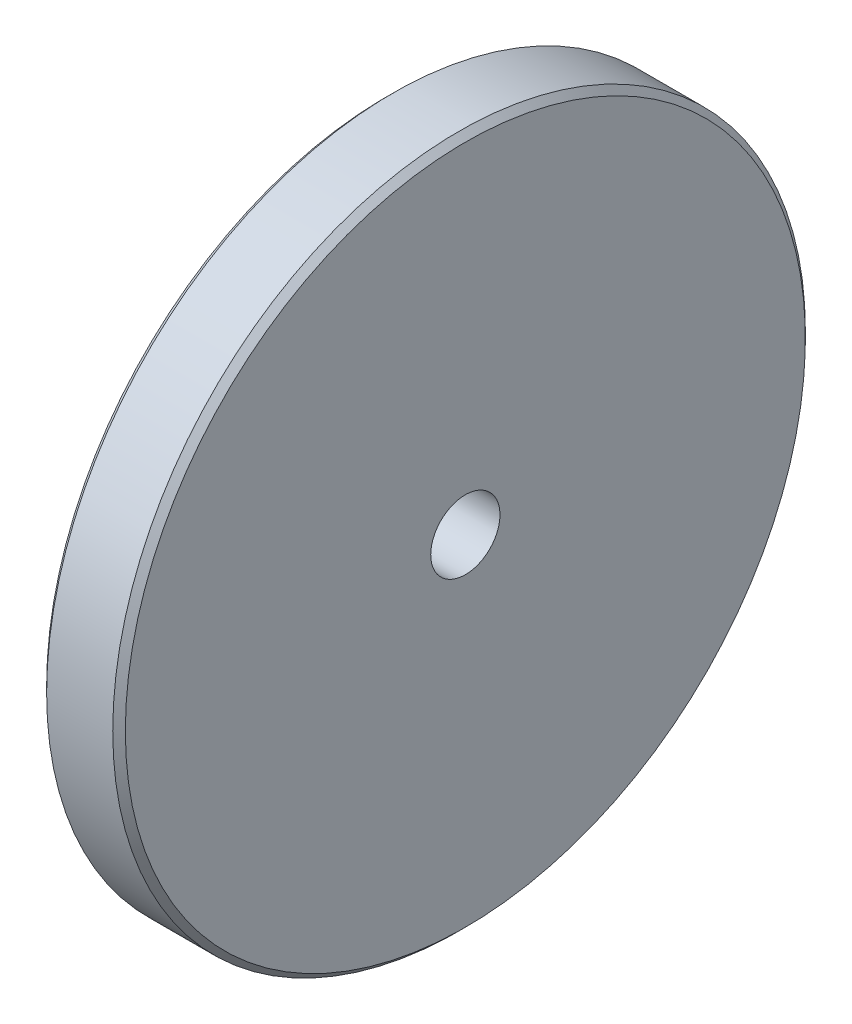
ISO-10303-21;
HEADER;
FILE_DESCRIPTION(('STEP AP214'),'2;1');
FILE_NAME('part.step','',(''),(''),'','','');
FILE_SCHEMA(('AUTOMOTIVE_DESIGN { 1 0 10303 214 1 1 1 1 }'));
ENDSEC;
DATA;
#1=APPLICATION_CONTEXT('core data for automotive mechanical design processes');
#2=APPLICATION_PROTOCOL_DEFINITION('international standard','automotive_design',2000,#1);
#3=PRODUCT_CONTEXT('',#1,'mechanical');
#4=PRODUCT('Part','Part','',(#3));
#5=PRODUCT_RELATED_PRODUCT_CATEGORY('part','',(#4));
#6=PRODUCT_DEFINITION_FORMATION('','',#4);
#7=PRODUCT_DEFINITION_CONTEXT('part definition',#1,'design');
#8=PRODUCT_DEFINITION('design','',#6,#7);
#9=PRODUCT_DEFINITION_SHAPE('','',#8);
#10=(LENGTH_UNIT() NAMED_UNIT(*) SI_UNIT(.MILLI.,.METRE.));
#11=(NAMED_UNIT(*) PLANE_ANGLE_UNIT() SI_UNIT($,.RADIAN.));
#12=(NAMED_UNIT(*) SI_UNIT($,.STERADIAN.) SOLID_ANGLE_UNIT());
#13=UNCERTAINTY_MEASURE_WITH_UNIT(LENGTH_MEASURE(1.E-05),#10,'distance_accuracy_value','');
#14=(GEOMETRIC_REPRESENTATION_CONTEXT(3) GLOBAL_UNCERTAINTY_ASSIGNED_CONTEXT((#13)) GLOBAL_UNIT_ASSIGNED_CONTEXT((#10,
#11,#12)) REPRESENTATION_CONTEXT('',''));
#15=CARTESIAN_POINT('',(0.,0.,0.));
#16=DIRECTION('',(0.,0.,1.));
#17=DIRECTION('',(1.,0.,0.));
#18=AXIS2_PLACEMENT_3D('',#15,#16,#17);
#19=CARTESIAN_POINT('',(23.,0.,0.));
#20=DIRECTION('',(-1.,0.,0.));
#21=DIRECTION('',(0.,0.,1.));
#22=AXIS2_PLACEMENT_3D('',#19,#20,#21);
#23=CONICAL_SURFACE('',#22,110.,0.785398163397448);
#24=CARTESIAN_POINT('',(25.,0.,0.));
#25=DIRECTION('',(-1.,0.,0.));
#26=DIRECTION('',(0.,0.,1.));
#27=AXIS2_PLACEMENT_3D('',#24,#25,#26);
#28=CIRCLE('',#27,108.);
#29=CARTESIAN_POINT('',(25.,0.,108.));
#30=VERTEX_POINT('',#29);
#31=EDGE_CURVE('E54',#30,#30,#28,.T.);
#32=ORIENTED_EDGE('',*,*,#31,.T.);
#33=EDGE_LOOP('',(#32));
#34=FACE_BOUND('',#33,.T.);
#35=CARTESIAN_POINT('',(23.,0.,0.));
#36=DIRECTION('',(-1.,0.,0.));
#37=DIRECTION('',(0.,0.,1.));
#38=AXIS2_PLACEMENT_3D('',#35,#36,#37);
#39=CIRCLE('',#38,110.);
#40=CARTESIAN_POINT('',(23.,0.,110.));
#41=VERTEX_POINT('',#40);
#42=EDGE_CURVE('E10',#41,#41,#39,.T.);
#43=ORIENTED_EDGE('',*,*,#42,.F.);
#44=EDGE_LOOP('',(#43));
#45=FACE_BOUND('',#44,.T.);
#46=ADVANCED_FACE('F32',(#34,#45),#23,.T.);
#47=CARTESIAN_POINT('',(0.,0.,0.));
#48=DIRECTION('',(-1.,0.,0.));
#49=DIRECTION('',(0.,0.,1.));
#50=AXIS2_PLACEMENT_3D('',#47,#48,#49);
#51=CYLINDRICAL_SURFACE('',#50,110.);
#52=ORIENTED_EDGE('',*,*,#42,.T.);
#53=EDGE_LOOP('',(#52));
#54=FACE_BOUND('',#53,.T.);
#55=CARTESIAN_POINT('',(2.,0.,0.));
#56=DIRECTION('',(-1.,0.,0.));
#57=DIRECTION('',(0.,0.,1.));
#58=AXIS2_PLACEMENT_3D('',#55,#56,#57);
#59=CIRCLE('',#58,110.);
#60=CARTESIAN_POINT('',(2.,0.,110.));
#61=VERTEX_POINT('',#60);
#62=EDGE_CURVE('E38',#61,#61,#59,.T.);
#63=ORIENTED_EDGE('',*,*,#62,.F.);
#64=EDGE_LOOP('',(#63));
#65=FACE_BOUND('',#64,.T.);
#66=ADVANCED_FACE('F72',(#54,#65),#51,.T.);
#67=CARTESIAN_POINT('',(0.,0.,0.));
#68=DIRECTION('',(1.,0.,0.));
#69=DIRECTION('',(0.,0.,-1.));
#70=AXIS2_PLACEMENT_3D('',#67,#68,#69);
#71=CONICAL_SURFACE('',#70,108.,0.785398163397449);
#72=ORIENTED_EDGE('',*,*,#62,.T.);
#73=EDGE_LOOP('',(#72));
#74=FACE_BOUND('',#73,.T.);
#75=CARTESIAN_POINT('',(0.,0.,0.));
#76=DIRECTION('',(-1.,0.,0.));
#77=DIRECTION('',(0.,0.,1.));
#78=AXIS2_PLACEMENT_3D('',#75,#76,#77);
#79=CIRCLE('',#78,108.);
#80=CARTESIAN_POINT('',(0.,0.,108.));
#81=VERTEX_POINT('',#80);
#82=EDGE_CURVE('E42',#81,#81,#79,.T.);
#83=ORIENTED_EDGE('',*,*,#82,.F.);
#84=EDGE_LOOP('',(#83));
#85=FACE_BOUND('',#84,.T.);
#86=ADVANCED_FACE('F76',(#74,#85),#71,.T.);
#87=CARTESIAN_POINT('',(0.,0.,0.));
#88=DIRECTION('',(-1.,0.,0.));
#89=DIRECTION('',(0.,0.,1.));
#90=AXIS2_PLACEMENT_3D('',#87,#88,#89);
#91=PLANE('',#90);
#92=ORIENTED_EDGE('',*,*,#82,.T.);
#93=EDGE_LOOP('',(#92));
#94=FACE_BOUND('',#93,.T.);
#95=CARTESIAN_POINT('',(0.,0.,0.));
#96=DIRECTION('',(-1.,0.,0.));
#97=DIRECTION('',(0.,0.,1.));
#98=AXIS2_PLACEMENT_3D('',#95,#96,#97);
#99=CIRCLE('',#98,11.);
#100=CARTESIAN_POINT('',(0.,0.,11.));
#101=VERTEX_POINT('',#100);
#102=EDGE_CURVE('E46',#101,#101,#99,.T.);
#103=ORIENTED_EDGE('',*,*,#102,.F.);
#104=EDGE_LOOP('',(#103));
#105=FACE_BOUND('',#104,.T.);
#106=ADVANCED_FACE('F68',(#94,#105),#91,.T.);
#107=CARTESIAN_POINT('',(0.,0.,0.));
#108=DIRECTION('',(-1.,0.,0.));
#109=DIRECTION('',(0.,0.,1.));
#110=AXIS2_PLACEMENT_3D('',#107,#108,#109);
#111=CYLINDRICAL_SURFACE('',#110,11.);
#112=CARTESIAN_POINT('',(25.,0.,0.));
#113=DIRECTION('',(-1.,0.,0.));
#114=DIRECTION('',(0.,0.,1.));
#115=AXIS2_PLACEMENT_3D('',#112,#113,#114);
#116=CIRCLE('',#115,11.);
#117=CARTESIAN_POINT('',(25.,0.,11.));
#118=VERTEX_POINT('',#117);
#119=EDGE_CURVE('E51',#118,#118,#116,.T.);
#120=ORIENTED_EDGE('',*,*,#119,.F.);
#121=EDGE_LOOP('',(#120));
#122=FACE_BOUND('',#121,.T.);
#123=ORIENTED_EDGE('',*,*,#102,.T.);
#124=EDGE_LOOP('',(#123));
#125=FACE_BOUND('',#124,.T.);
#126=ADVANCED_FACE('F62',(#122,#125),#111,.F.);
#127=CARTESIAN_POINT('',(25.,0.,0.));
#128=DIRECTION('',(1.,0.,0.));
#129=DIRECTION('',(0.,0.,-1.));
#130=AXIS2_PLACEMENT_3D('',#127,#128,#129);
#131=PLANE('',#130);
#132=ORIENTED_EDGE('',*,*,#119,.T.);
#133=EDGE_LOOP('',(#132));
#134=FACE_BOUND('',#133,.T.);
#135=ORIENTED_EDGE('',*,*,#31,.F.);
#136=EDGE_LOOP('',(#135));
#137=FACE_BOUND('',#136,.T.);
#138=ADVANCED_FACE('F60',(#134,#137),#131,.T.);
#139=CLOSED_SHELL('',(#46,#66,#86,#106,#126,#138));
#140=MANIFOLD_SOLID_BREP('B2',#139);
#141=ADVANCED_BREP_SHAPE_REPRESENTATION('',(#18,#140),#14);
#142=SHAPE_DEFINITION_REPRESENTATION(#9,#141);
ENDSEC;
END-ISO-10303-21;
